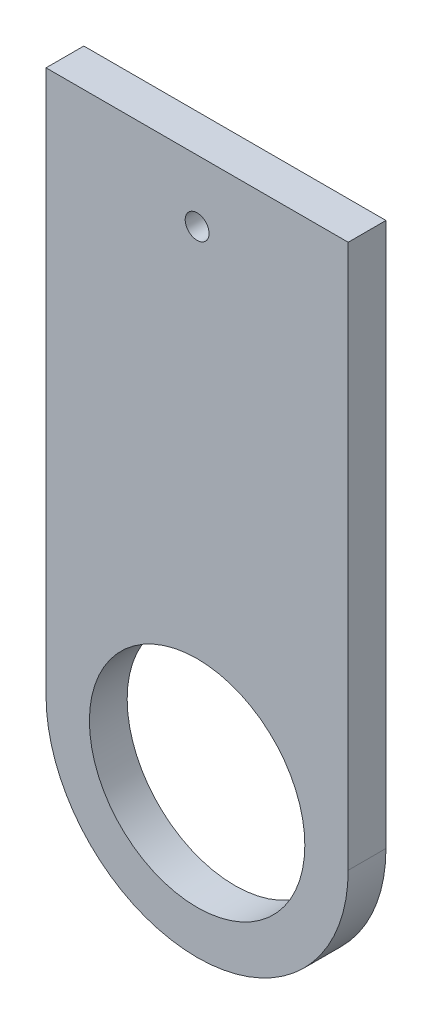
ISO-10303-21;
HEADER;
FILE_DESCRIPTION(('STEP AP214'),'2;1');
FILE_NAME('part.step','',(''),(''),'','','');
FILE_SCHEMA(('AUTOMOTIVE_DESIGN { 1 0 10303 214 1 1 1 1 }'));
ENDSEC;
DATA;
#1=APPLICATION_CONTEXT('core data for automotive mechanical design processes');
#2=APPLICATION_PROTOCOL_DEFINITION('international standard','automotive_design',2000,#1);
#3=PRODUCT_CONTEXT('',#1,'mechanical');
#4=PRODUCT('Part','Part','',(#3));
#5=PRODUCT_RELATED_PRODUCT_CATEGORY('part','',(#4));
#6=PRODUCT_DEFINITION_FORMATION('','',#4);
#7=PRODUCT_DEFINITION_CONTEXT('part definition',#1,'design');
#8=PRODUCT_DEFINITION('design','',#6,#7);
#9=PRODUCT_DEFINITION_SHAPE('','',#8);
#10=(LENGTH_UNIT() NAMED_UNIT(*) SI_UNIT(.MILLI.,.METRE.));
#11=(NAMED_UNIT(*) PLANE_ANGLE_UNIT() SI_UNIT($,.RADIAN.));
#12=(NAMED_UNIT(*) SI_UNIT($,.STERADIAN.) SOLID_ANGLE_UNIT());
#13=UNCERTAINTY_MEASURE_WITH_UNIT(LENGTH_MEASURE(1.E-05),#10,'distance_accuracy_value','');
#14=(GEOMETRIC_REPRESENTATION_CONTEXT(3) GLOBAL_UNCERTAINTY_ASSIGNED_CONTEXT((#13)) GLOBAL_UNIT_ASSIGNED_CONTEXT((#10,
#11,#12)) REPRESENTATION_CONTEXT('',''));
#15=CARTESIAN_POINT('',(0.,0.,0.));
#16=DIRECTION('',(0.,0.,1.));
#17=DIRECTION('',(1.,0.,0.));
#18=AXIS2_PLACEMENT_3D('',#15,#16,#17);
#19=CARTESIAN_POINT('',(0.,-76.7077662842641,5.));
#20=DIRECTION('',(0.,0.,1.));
#21=DIRECTION('',(1.,0.,0.));
#22=AXIS2_PLACEMENT_3D('',#19,#20,#21);
#23=PLANE('',#22);
#24=CARTESIAN_POINT('',(0.,-12.9116557346265,5.));
#25=DIRECTION('',(0.,0.,1.));
#26=DIRECTION('',(1.,0.,0.));
#27=AXIS2_PLACEMENT_3D('',#24,#25,#26);
#28=CIRCLE('',#27,1.58);
#29=CARTESIAN_POINT('',(1.58000000000002,-12.9116557346265,5.));
#30=VERTEX_POINT('',#29);
#31=EDGE_CURVE('E104',#30,#30,#28,.T.);
#32=ORIENTED_EDGE('',*,*,#31,.F.);
#33=EDGE_LOOP('',(#32));
#34=FACE_BOUND('',#33,.T.);
#35=CARTESIAN_POINT('',(0.,-76.7077662842641,5.));
#36=DIRECTION('',(0.,0.,1.));
#37=DIRECTION('',(1.,0.,0.));
#38=AXIS2_PLACEMENT_3D('',#35,#36,#37);
#39=CIRCLE('',#38,20.);
#40=CARTESIAN_POINT('',(-20.,-76.7077662842641,5.));
#41=VERTEX_POINT('',#40);
#42=CARTESIAN_POINT('',(20.,-76.7077662842641,5.));
#43=VERTEX_POINT('',#42);
#44=EDGE_CURVE('E87',#41,#43,#39,.T.);
#45=ORIENTED_EDGE('',*,*,#44,.T.);
#46=DIRECTION('',(0.,1.,0.));
#47=VECTOR('',#46,1.);
#48=CARTESIAN_POINT('',(20.,-4.70776628426411,5.));
#49=LINE('',#48,#47);
#50=CARTESIAN_POINT('',(20.,-4.70776628426411,5.));
#51=VERTEX_POINT('',#50);
#52=EDGE_CURVE('E81',#43,#51,#49,.T.);
#53=ORIENTED_EDGE('',*,*,#52,.T.);
#54=DIRECTION('',(-1.,0.,0.));
#55=VECTOR('',#54,1.);
#56=CARTESIAN_POINT('',(-20.,-4.70776628426411,5.));
#57=LINE('',#56,#55);
#58=CARTESIAN_POINT('',(-20.,-4.70776628426411,5.));
#59=VERTEX_POINT('',#58);
#60=EDGE_CURVE('E84',#51,#59,#57,.T.);
#61=ORIENTED_EDGE('',*,*,#60,.T.);
#62=DIRECTION('',(0.,-1.,0.));
#63=VECTOR('',#62,1.);
#64=CARTESIAN_POINT('',(-20.,-4.70776628426411,5.));
#65=LINE('',#64,#63);
#66=EDGE_CURVE('E53',#59,#41,#65,.T.);
#67=ORIENTED_EDGE('',*,*,#66,.T.);
#68=EDGE_LOOP('',(#45,#53,#61,#67));
#69=FACE_BOUND('',#68,.T.);
#70=CARTESIAN_POINT('',(0.,-76.7077662842641,5.));
#71=DIRECTION('',(0.,0.,1.));
#72=DIRECTION('',(1.,0.,0.));
#73=AXIS2_PLACEMENT_3D('',#70,#71,#72);
#74=CIRCLE('',#73,14.26);
#75=CARTESIAN_POINT('',(14.26,-76.7077662842641,5.));
#76=VERTEX_POINT('',#75);
#77=EDGE_CURVE('E116',#76,#76,#74,.T.);
#78=ORIENTED_EDGE('',*,*,#77,.F.);
#79=EDGE_LOOP('',(#78));
#80=FACE_BOUND('',#79,.T.);
#81=ADVANCED_FACE('F36',(#34,#69,#80),#23,.T.);
#82=CARTESIAN_POINT('',(0.,-76.7077662842641,0.));
#83=DIRECTION('',(0.,0.,1.));
#84=DIRECTION('',(1.,0.,0.));
#85=AXIS2_PLACEMENT_3D('',#82,#83,#84);
#86=PLANE('',#85);
#87=CARTESIAN_POINT('',(0.,-76.7077662842641,0.));
#88=DIRECTION('',(0.,0.,1.));
#89=DIRECTION('',(1.,0.,0.));
#90=AXIS2_PLACEMENT_3D('',#87,#88,#89);
#91=CIRCLE('',#90,20.);
#92=CARTESIAN_POINT('',(-20.,-76.7077662842641,0.));
#93=VERTEX_POINT('',#92);
#94=CARTESIAN_POINT('',(20.,-76.7077662842641,0.));
#95=VERTEX_POINT('',#94);
#96=EDGE_CURVE('E101',#93,#95,#91,.T.);
#97=ORIENTED_EDGE('',*,*,#96,.F.);
#98=DIRECTION('',(0.,-1.,0.));
#99=VECTOR('',#98,1.);
#100=CARTESIAN_POINT('',(-20.,-76.7077662842641,0.));
#101=LINE('',#100,#99);
#102=CARTESIAN_POINT('',(-20.,-4.70776628426411,0.));
#103=VERTEX_POINT('',#102);
#104=EDGE_CURVE('E70',#103,#93,#101,.T.);
#105=ORIENTED_EDGE('',*,*,#104,.F.);
#106=DIRECTION('',(-1.,0.,0.));
#107=VECTOR('',#106,1.);
#108=CARTESIAN_POINT('',(-20.,-4.70776628426411,0.));
#109=LINE('',#108,#107);
#110=CARTESIAN_POINT('',(20.,-4.70776628426411,0.));
#111=VERTEX_POINT('',#110);
#112=EDGE_CURVE('E106',#111,#103,#109,.T.);
#113=ORIENTED_EDGE('',*,*,#112,.F.);
#114=DIRECTION('',(0.,1.,0.));
#115=VECTOR('',#114,1.);
#116=CARTESIAN_POINT('',(20.,-4.70776628426411,0.));
#117=LINE('',#116,#115);
#118=EDGE_CURVE('E92',#95,#111,#117,.T.);
#119=ORIENTED_EDGE('',*,*,#118,.F.);
#120=EDGE_LOOP('',(#97,#105,#113,#119));
#121=FACE_BOUND('',#120,.T.);
#122=CARTESIAN_POINT('',(0.,-12.9116557346265,0.));
#123=DIRECTION('',(0.,0.,1.));
#124=DIRECTION('',(1.,0.,0.));
#125=AXIS2_PLACEMENT_3D('',#122,#123,#124);
#126=CIRCLE('',#125,1.58);
#127=CARTESIAN_POINT('',(1.58000000000002,-12.9116557346265,0.));
#128=VERTEX_POINT('',#127);
#129=EDGE_CURVE('E113',#128,#128,#126,.T.);
#130=ORIENTED_EDGE('',*,*,#129,.T.);
#131=EDGE_LOOP('',(#130));
#132=FACE_BOUND('',#131,.T.);
#133=CARTESIAN_POINT('',(0.,-76.7077662842641,0.));
#134=DIRECTION('',(0.,0.,1.));
#135=DIRECTION('',(1.,0.,0.));
#136=AXIS2_PLACEMENT_3D('',#133,#134,#135);
#137=CIRCLE('',#136,14.26);
#138=CARTESIAN_POINT('',(14.26,-76.7077662842641,0.));
#139=VERTEX_POINT('',#138);
#140=EDGE_CURVE('E119',#139,#139,#137,.T.);
#141=ORIENTED_EDGE('',*,*,#140,.T.);
#142=EDGE_LOOP('',(#141));
#143=FACE_BOUND('',#142,.T.);
#144=ADVANCED_FACE('F128',(#121,#132,#143),#86,.F.);
#145=CARTESIAN_POINT('',(0.,-76.7077662842641,5.));
#146=DIRECTION('',(0.,0.,-1.));
#147=DIRECTION('',(-1.,0.,0.));
#148=AXIS2_PLACEMENT_3D('',#145,#146,#147);
#149=CYLINDRICAL_SURFACE('',#148,20.);
#150=ORIENTED_EDGE('',*,*,#96,.T.);
#151=DIRECTION('',(0.,0.,-1.));
#152=VECTOR('',#151,1.);
#153=CARTESIAN_POINT('',(20.,-76.7077662842641,5.));
#154=LINE('',#153,#152);
#155=EDGE_CURVE('E11',#43,#95,#154,.T.);
#156=ORIENTED_EDGE('',*,*,#155,.F.);
#157=ORIENTED_EDGE('',*,*,#44,.F.);
#158=DIRECTION('',(0.,0.,-1.));
#159=VECTOR('',#158,1.);
#160=CARTESIAN_POINT('',(-20.,-76.7077662842641,5.));
#161=LINE('',#160,#159);
#162=EDGE_CURVE('E97',#41,#93,#161,.T.);
#163=ORIENTED_EDGE('',*,*,#162,.T.);
#164=EDGE_LOOP('',(#150,#156,#157,#163));
#165=FACE_BOUND('',#164,.T.);
#166=ADVANCED_FACE('F38',(#165),#149,.T.);
#167=CARTESIAN_POINT('',(20.,-4.70776628426411,5.));
#168=DIRECTION('',(-1.,0.,0.));
#169=DIRECTION('',(0.,-1.,0.));
#170=AXIS2_PLACEMENT_3D('',#167,#168,#169);
#171=PLANE('',#170);
#172=ORIENTED_EDGE('',*,*,#118,.T.);
#173=DIRECTION('',(0.,0.,-1.));
#174=VECTOR('',#173,1.);
#175=CARTESIAN_POINT('',(20.,-4.70776628426411,5.));
#176=LINE('',#175,#174);
#177=EDGE_CURVE('E45',#51,#111,#176,.T.);
#178=ORIENTED_EDGE('',*,*,#177,.F.);
#179=ORIENTED_EDGE('',*,*,#52,.F.);
#180=ORIENTED_EDGE('',*,*,#155,.T.);
#181=EDGE_LOOP('',(#172,#178,#179,#180));
#182=FACE_BOUND('',#181,.T.);
#183=ADVANCED_FACE('F91',(#182),#171,.F.);
#184=CARTESIAN_POINT('',(-20.,-4.70776628426411,5.));
#185=DIRECTION('',(0.,-1.,0.));
#186=DIRECTION('',(1.,0.,0.));
#187=AXIS2_PLACEMENT_3D('',#184,#185,#186);
#188=PLANE('',#187);
#189=ORIENTED_EDGE('',*,*,#112,.T.);
#190=DIRECTION('',(0.,0.,-1.));
#191=VECTOR('',#190,1.);
#192=CARTESIAN_POINT('',(-20.,-4.70776628426411,5.));
#193=LINE('',#192,#191);
#194=EDGE_CURVE('E94',#59,#103,#193,.T.);
#195=ORIENTED_EDGE('',*,*,#194,.F.);
#196=ORIENTED_EDGE('',*,*,#60,.F.);
#197=ORIENTED_EDGE('',*,*,#177,.T.);
#198=EDGE_LOOP('',(#189,#195,#196,#197));
#199=FACE_BOUND('',#198,.T.);
#200=ADVANCED_FACE('F95',(#199),#188,.F.);
#201=CARTESIAN_POINT('',(-20.,-76.7077662842641,5.));
#202=DIRECTION('',(1.,0.,0.));
#203=DIRECTION('',(0.,1.,0.));
#204=AXIS2_PLACEMENT_3D('',#201,#202,#203);
#205=PLANE('',#204);
#206=ORIENTED_EDGE('',*,*,#104,.T.);
#207=ORIENTED_EDGE('',*,*,#162,.F.);
#208=ORIENTED_EDGE('',*,*,#66,.F.);
#209=ORIENTED_EDGE('',*,*,#194,.T.);
#210=EDGE_LOOP('',(#206,#207,#208,#209));
#211=FACE_BOUND('',#210,.T.);
#212=ADVANCED_FACE('F110',(#211),#205,.F.);
#213=CARTESIAN_POINT('',(0.,-12.9116557346265,5.));
#214=DIRECTION('',(0.,0.,-1.));
#215=DIRECTION('',(-1.,0.,0.));
#216=AXIS2_PLACEMENT_3D('',#213,#214,#215);
#217=CYLINDRICAL_SURFACE('',#216,1.58);
#218=ORIENTED_EDGE('',*,*,#31,.T.);
#219=EDGE_LOOP('',(#218));
#220=FACE_BOUND('',#219,.T.);
#221=ORIENTED_EDGE('',*,*,#129,.F.);
#222=EDGE_LOOP('',(#221));
#223=FACE_BOUND('',#222,.T.);
#224=ADVANCED_FACE('F137',(#220,#223),#217,.F.);
#225=CARTESIAN_POINT('',(0.,-76.7077662842641,5.));
#226=DIRECTION('',(0.,0.,-1.));
#227=DIRECTION('',(-1.,0.,0.));
#228=AXIS2_PLACEMENT_3D('',#225,#226,#227);
#229=CYLINDRICAL_SURFACE('',#228,14.26);
#230=ORIENTED_EDGE('',*,*,#77,.T.);
#231=EDGE_LOOP('',(#230));
#232=FACE_BOUND('',#231,.T.);
#233=ORIENTED_EDGE('',*,*,#140,.F.);
#234=EDGE_LOOP('',(#233));
#235=FACE_BOUND('',#234,.T.);
#236=ADVANCED_FACE('F125',(#232,#235),#229,.F.);
#237=CLOSED_SHELL('',(#81,#144,#166,#183,#200,#212,#224,#236));
#238=MANIFOLD_SOLID_BREP('B2',#237);
#239=ADVANCED_BREP_SHAPE_REPRESENTATION('',(#18,#238),#14);
#240=SHAPE_DEFINITION_REPRESENTATION(#9,#239);
ENDSEC;
END-ISO-10303-21;
